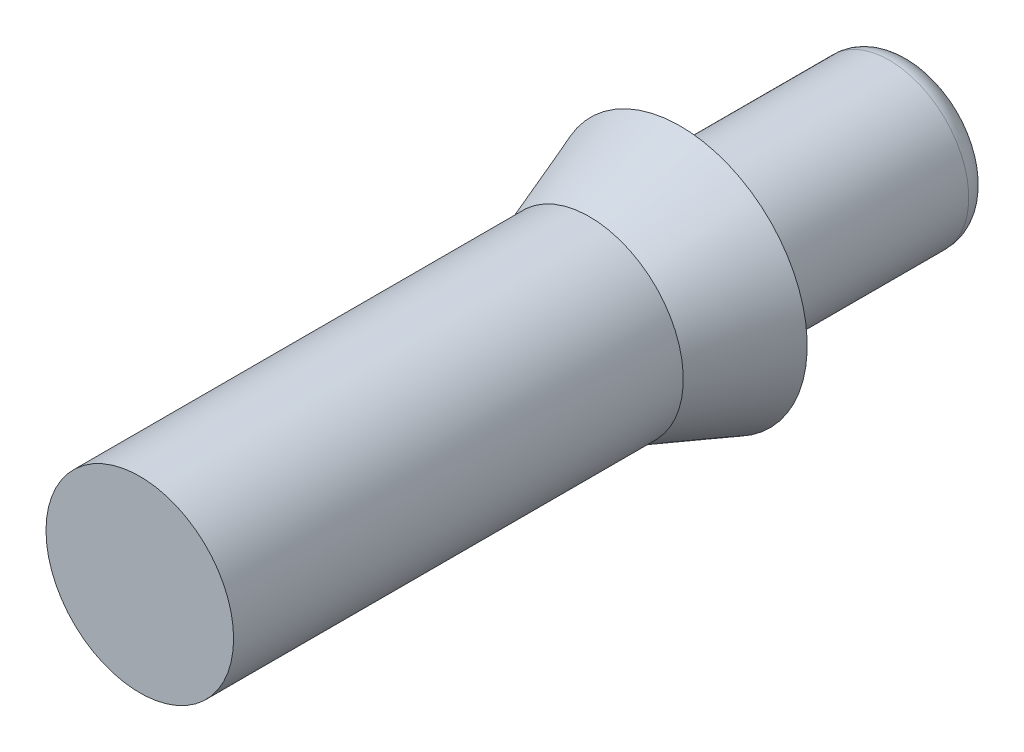
ISO-10303-21;
HEADER;
FILE_DESCRIPTION(('STEP AP214'),'2;1');
FILE_NAME('part.step','',(''),(''),'','','');
FILE_SCHEMA(('AUTOMOTIVE_DESIGN { 1 0 10303 214 1 1 1 1 }'));
ENDSEC;
DATA;
#1=APPLICATION_CONTEXT('core data for automotive mechanical design processes');
#2=APPLICATION_PROTOCOL_DEFINITION('international standard','automotive_design',2000,#1);
#3=PRODUCT_CONTEXT('',#1,'mechanical');
#4=PRODUCT('Part','Part','',(#3));
#5=PRODUCT_RELATED_PRODUCT_CATEGORY('part','',(#4));
#6=PRODUCT_DEFINITION_FORMATION('','',#4);
#7=PRODUCT_DEFINITION_CONTEXT('part definition',#1,'design');
#8=PRODUCT_DEFINITION('design','',#6,#7);
#9=PRODUCT_DEFINITION_SHAPE('','',#8);
#10=(LENGTH_UNIT() NAMED_UNIT(*) SI_UNIT(.MILLI.,.METRE.));
#11=(NAMED_UNIT(*) PLANE_ANGLE_UNIT() SI_UNIT($,.RADIAN.));
#12=(NAMED_UNIT(*) SI_UNIT($,.STERADIAN.) SOLID_ANGLE_UNIT());
#13=UNCERTAINTY_MEASURE_WITH_UNIT(LENGTH_MEASURE(1.E-05),#10,'distance_accuracy_value','');
#14=(GEOMETRIC_REPRESENTATION_CONTEXT(3) GLOBAL_UNCERTAINTY_ASSIGNED_CONTEXT((#13)) GLOBAL_UNIT_ASSIGNED_CONTEXT((#10,
#11,#12)) REPRESENTATION_CONTEXT('',''));
#15=CARTESIAN_POINT('',(0.,0.,0.));
#16=DIRECTION('',(0.,0.,1.));
#17=DIRECTION('',(1.,0.,0.));
#18=AXIS2_PLACEMENT_3D('',#15,#16,#17);
#19=CARTESIAN_POINT('',(0.,0.,-7.1));
#20=DIRECTION('',(0.,0.,-1.));
#21=DIRECTION('',(0.,-1.,0.));
#22=AXIS2_PLACEMENT_3D('',#19,#20,#21);
#23=PLANE('',#22);
#24=CARTESIAN_POINT('',(0.,0.,-7.1));
#25=DIRECTION('',(0.,0.,-1.));
#26=DIRECTION('',(-1.,0.,0.));
#27=AXIS2_PLACEMENT_3D('',#24,#25,#26);
#28=CIRCLE('',#27,1.25);
#29=CARTESIAN_POINT('',(-1.25,0.,-7.1));
#30=VERTEX_POINT('',#29);
#31=EDGE_CURVE('E45',#30,#30,#28,.T.);
#32=ORIENTED_EDGE('',*,*,#31,.T.);
#33=EDGE_LOOP('',(#32));
#34=FACE_BOUND('',#33,.T.);
#35=ADVANCED_FACE('F15',(#34),#23,.T.);
#36=CARTESIAN_POINT('',(-2.7929404685324,0.,-2.));
#37=DIRECTION('',(0.,0.,-1.));
#38=DIRECTION('',(0.,-1.,0.));
#39=AXIS2_PLACEMENT_3D('',#36,#37,#38);
#40=PLANE('',#39);
#41=CARTESIAN_POINT('',(0.,0.,-2.));
#42=DIRECTION('',(0.,0.,-1.));
#43=DIRECTION('',(-1.,0.,0.));
#44=AXIS2_PLACEMENT_3D('',#41,#42,#43);
#45=CIRCLE('',#44,1.75);
#46=CARTESIAN_POINT('',(-1.75,0.,-2.));
#47=VERTEX_POINT('',#46);
#48=EDGE_CURVE('E40',#47,#47,#45,.T.);
#49=ORIENTED_EDGE('',*,*,#48,.F.);
#50=EDGE_LOOP('',(#49));
#51=FACE_BOUND('',#50,.T.);
#52=CARTESIAN_POINT('',(0.,0.,-2.));
#53=DIRECTION('',(0.,0.,-1.));
#54=DIRECTION('',(-1.,0.,0.));
#55=AXIS2_PLACEMENT_3D('',#52,#53,#54);
#56=CIRCLE('',#55,2.7929404685324);
#57=CARTESIAN_POINT('',(-2.7929404685324,0.,-2.));
#58=VERTEX_POINT('',#57);
#59=EDGE_CURVE('E23',#58,#58,#56,.T.);
#60=ORIENTED_EDGE('',*,*,#59,.T.);
#61=EDGE_LOOP('',(#60));
#62=FACE_BOUND('',#61,.T.);
#63=ADVANCED_FACE('F17',(#51,#62),#40,.T.);
#64=CARTESIAN_POINT('',(0.,0.,9.9));
#65=DIRECTION('',(0.,0.,1.));
#66=DIRECTION('',(1.,0.,0.));
#67=AXIS2_PLACEMENT_3D('',#64,#65,#66);
#68=PLANE('',#67);
#69=CARTESIAN_POINT('',(0.,0.,9.9));
#70=DIRECTION('',(0.,0.,1.));
#71=DIRECTION('',(1.,0.,0.));
#72=AXIS2_PLACEMENT_3D('',#69,#70,#71);
#73=CIRCLE('',#72,2.065);
#74=CARTESIAN_POINT('',(2.065,0.,9.9));
#75=VERTEX_POINT('',#74);
#76=EDGE_CURVE('E10',#75,#75,#73,.T.);
#77=ORIENTED_EDGE('',*,*,#76,.T.);
#78=EDGE_LOOP('',(#77));
#79=FACE_BOUND('',#78,.T.);
#80=ADVANCED_FACE('F77',(#79),#68,.T.);
#81=CARTESIAN_POINT('',(0.,0.,9.9));
#82=DIRECTION('',(0.,0.,-1.));
#83=DIRECTION('',(-1.,0.,0.));
#84=AXIS2_PLACEMENT_3D('',#81,#82,#83);
#85=CYLINDRICAL_SURFACE('',#84,2.065);
#86=CARTESIAN_POINT('',(0.,0.,0.));
#87=DIRECTION('',(0.,0.,-1.));
#88=DIRECTION('',(-1.,0.,0.));
#89=AXIS2_PLACEMENT_3D('',#86,#87,#88);
#90=CIRCLE('',#89,2.065);
#91=CARTESIAN_POINT('',(-2.065,0.,0.));
#92=VERTEX_POINT('',#91);
#93=EDGE_CURVE('E32',#92,#92,#90,.T.);
#94=ORIENTED_EDGE('',*,*,#93,.F.);
#95=EDGE_LOOP('',(#94));
#96=FACE_BOUND('',#95,.T.);
#97=ORIENTED_EDGE('',*,*,#76,.F.);
#98=EDGE_LOOP('',(#97));
#99=FACE_BOUND('',#98,.T.);
#100=ADVANCED_FACE('F81',(#96,#99),#85,.T.);
#101=CARTESIAN_POINT('',(0.,0.,-2.));
#102=DIRECTION('',(0.,0.,-1.));
#103=DIRECTION('',(-1.,0.,0.));
#104=AXIS2_PLACEMENT_3D('',#101,#102,#103);
#105=CONICAL_SURFACE('',#104,2.7929404685324,0.349065850398863);
#106=ORIENTED_EDGE('',*,*,#59,.F.);
#107=EDGE_LOOP('',(#106));
#108=FACE_BOUND('',#107,.T.);
#109=ORIENTED_EDGE('',*,*,#93,.T.);
#110=EDGE_LOOP('',(#109));
#111=FACE_BOUND('',#110,.T.);
#112=ADVANCED_FACE('F66',(#108,#111),#105,.T.);
#113=CARTESIAN_POINT('',(0.,0.,-7.1));
#114=DIRECTION('',(0.,0.,1.));
#115=DIRECTION('',(1.,0.,0.));
#116=AXIS2_PLACEMENT_3D('',#113,#114,#115);
#117=CYLINDRICAL_SURFACE('',#116,1.75);
#118=ORIENTED_EDGE('',*,*,#48,.T.);
#119=EDGE_LOOP('',(#118));
#120=FACE_BOUND('',#119,.T.);
#121=CARTESIAN_POINT('',(0.,0.,-6.6));
#122=DIRECTION('',(0.,0.,1.));
#123=DIRECTION('',(-1.,0.,0.));
#124=AXIS2_PLACEMENT_3D('',#121,#122,#123);
#125=CIRCLE('',#124,1.75);
#126=CARTESIAN_POINT('',(-1.75,0.,-6.6));
#127=VERTEX_POINT('',#126);
#128=EDGE_CURVE('E49',#127,#127,#125,.T.);
#129=ORIENTED_EDGE('',*,*,#128,.T.);
#130=EDGE_LOOP('',(#129));
#131=FACE_BOUND('',#130,.T.);
#132=ADVANCED_FACE('F56',(#120,#131),#117,.T.);
#133=CARTESIAN_POINT('',(0.,0.,-6.6));
#134=DIRECTION('',(0.,0.,-1.));
#135=DIRECTION('',(-1.,0.,0.));
#136=AXIS2_PLACEMENT_3D('',#133,#134,#135);
#137=TOROIDAL_SURFACE('',#136,1.25,0.5);
#138=ORIENTED_EDGE('',*,*,#31,.F.);
#139=EDGE_LOOP('',(#138));
#140=FACE_BOUND('',#139,.T.);
#141=ORIENTED_EDGE('',*,*,#128,.F.);
#142=EDGE_LOOP('',(#141));
#143=FACE_BOUND('',#142,.T.);
#144=ADVANCED_FACE('F58',(#140,#143),#137,.T.);
#145=CLOSED_SHELL('',(#35,#63,#80,#100,#112,#132,#144));
#146=MANIFOLD_SOLID_BREP('B1',#145);
#147=ADVANCED_BREP_SHAPE_REPRESENTATION('',(#18,#146),#14);
#148=SHAPE_DEFINITION_REPRESENTATION(#9,#147);
ENDSEC;
END-ISO-10303-21;
